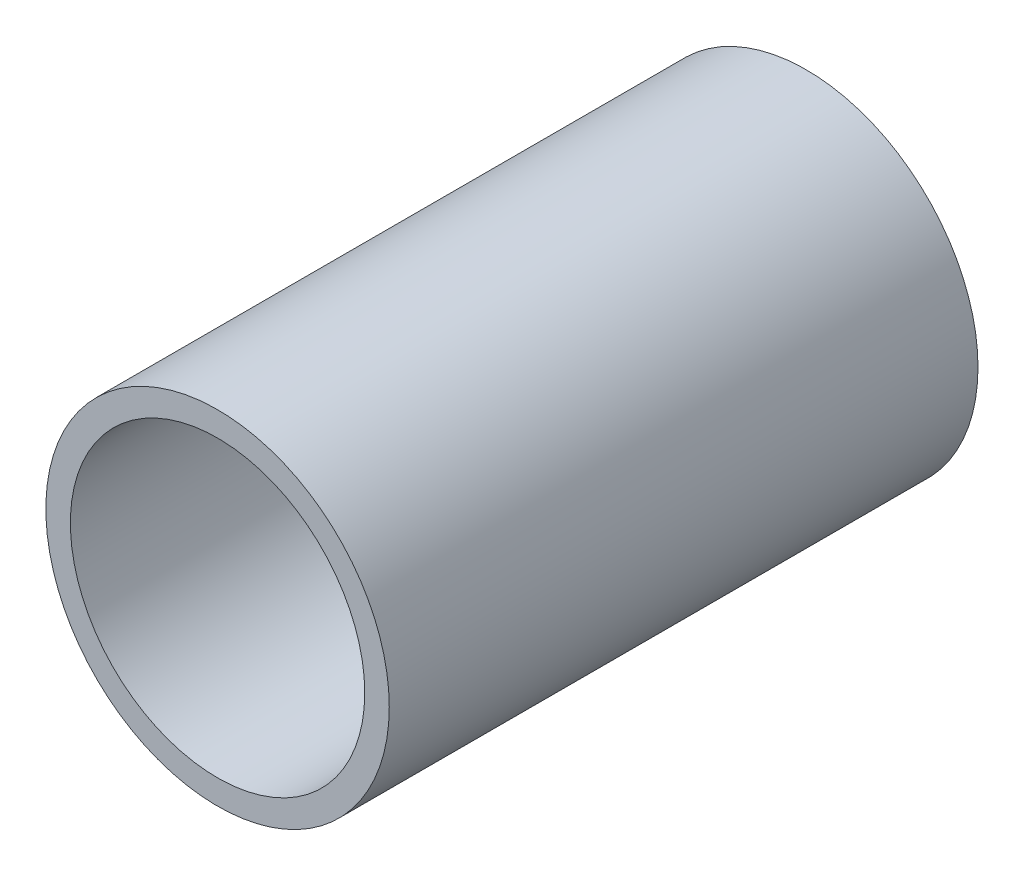
ISO-10303-21;
HEADER;
FILE_DESCRIPTION(('STEP AP214'),'2;1');
FILE_NAME('part.step','',(''),(''),'','','');
FILE_SCHEMA(('AUTOMOTIVE_DESIGN { 1 0 10303 214 1 1 1 1 }'));
ENDSEC;
DATA;
#1=APPLICATION_CONTEXT('core data for automotive mechanical design processes');
#2=APPLICATION_PROTOCOL_DEFINITION('international standard','automotive_design',2000,#1);
#3=PRODUCT_CONTEXT('',#1,'mechanical');
#4=PRODUCT('Part','Part','',(#3));
#5=PRODUCT_RELATED_PRODUCT_CATEGORY('part','',(#4));
#6=PRODUCT_DEFINITION_FORMATION('','',#4);
#7=PRODUCT_DEFINITION_CONTEXT('part definition',#1,'design');
#8=PRODUCT_DEFINITION('design','',#6,#7);
#9=PRODUCT_DEFINITION_SHAPE('','',#8);
#10=(LENGTH_UNIT() NAMED_UNIT(*) SI_UNIT(.MILLI.,.METRE.));
#11=(NAMED_UNIT(*) PLANE_ANGLE_UNIT() SI_UNIT($,.RADIAN.));
#12=(NAMED_UNIT(*) SI_UNIT($,.STERADIAN.) SOLID_ANGLE_UNIT());
#13=UNCERTAINTY_MEASURE_WITH_UNIT(LENGTH_MEASURE(1.E-05),#10,'distance_accuracy_value','');
#14=(GEOMETRIC_REPRESENTATION_CONTEXT(3) GLOBAL_UNCERTAINTY_ASSIGNED_CONTEXT((#13)) GLOBAL_UNIT_ASSIGNED_CONTEXT((#10,
#11,#12)) REPRESENTATION_CONTEXT('',''));
#15=CARTESIAN_POINT('',(0.,0.,0.));
#16=DIRECTION('',(0.,0.,1.));
#17=DIRECTION('',(1.,0.,0.));
#18=AXIS2_PLACEMENT_3D('',#15,#16,#17);
#19=CARTESIAN_POINT('',(0.,0.,120.));
#20=DIRECTION('',(0.,0.,1.));
#21=DIRECTION('',(1.,0.,0.));
#22=AXIS2_PLACEMENT_3D('',#19,#20,#21);
#23=PLANE('',#22);
#24=CARTESIAN_POINT('',(0.,0.,120.));
#25=DIRECTION('',(0.,0.,1.));
#26=DIRECTION('',(1.,0.,0.));
#27=AXIS2_PLACEMENT_3D('',#24,#25,#26);
#28=CIRCLE('',#27,35.);
#29=CARTESIAN_POINT('',(35.,0.,120.));
#30=VERTEX_POINT('',#29);
#31=EDGE_CURVE('E10',#30,#30,#28,.T.);
#32=ORIENTED_EDGE('',*,*,#31,.T.);
#33=EDGE_LOOP('',(#32));
#34=FACE_BOUND('',#33,.T.);
#35=CARTESIAN_POINT('',(0.,0.,120.));
#36=DIRECTION('',(0.,0.,1.));
#37=DIRECTION('',(1.,0.,0.));
#38=AXIS2_PLACEMENT_3D('',#35,#36,#37);
#39=CIRCLE('',#38,30.);
#40=CARTESIAN_POINT('',(30.,0.,120.));
#41=VERTEX_POINT('',#40);
#42=EDGE_CURVE('E42',#41,#41,#39,.T.);
#43=ORIENTED_EDGE('',*,*,#42,.F.);
#44=EDGE_LOOP('',(#43));
#45=FACE_BOUND('',#44,.T.);
#46=ADVANCED_FACE('F31',(#34,#45),#23,.T.);
#47=CARTESIAN_POINT('',(0.,0.,0.));
#48=DIRECTION('',(0.,0.,1.));
#49=DIRECTION('',(1.,0.,0.));
#50=AXIS2_PLACEMENT_3D('',#47,#48,#49);
#51=PLANE('',#50);
#52=CARTESIAN_POINT('',(0.,0.,0.));
#53=DIRECTION('',(0.,0.,1.));
#54=DIRECTION('',(1.,0.,0.));
#55=AXIS2_PLACEMENT_3D('',#52,#53,#54);
#56=CIRCLE('',#55,35.);
#57=CARTESIAN_POINT('',(35.,0.,0.));
#58=VERTEX_POINT('',#57);
#59=EDGE_CURVE('E35',#58,#58,#56,.T.);
#60=ORIENTED_EDGE('',*,*,#59,.F.);
#61=EDGE_LOOP('',(#60));
#62=FACE_BOUND('',#61,.T.);
#63=CARTESIAN_POINT('',(0.,0.,0.));
#64=DIRECTION('',(0.,0.,1.));
#65=DIRECTION('',(1.,0.,0.));
#66=AXIS2_PLACEMENT_3D('',#63,#64,#65);
#67=CIRCLE('',#66,30.);
#68=CARTESIAN_POINT('',(30.,0.,0.));
#69=VERTEX_POINT('',#68);
#70=EDGE_CURVE('E44',#69,#69,#67,.T.);
#71=ORIENTED_EDGE('',*,*,#70,.T.);
#72=EDGE_LOOP('',(#71));
#73=FACE_BOUND('',#72,.T.);
#74=ADVANCED_FACE('F54',(#62,#73),#51,.F.);
#75=CARTESIAN_POINT('',(0.,0.,120.));
#76=DIRECTION('',(0.,0.,-1.));
#77=DIRECTION('',(-1.,0.,0.));
#78=AXIS2_PLACEMENT_3D('',#75,#76,#77);
#79=CYLINDRICAL_SURFACE('',#78,35.);
#80=ORIENTED_EDGE('',*,*,#31,.F.);
#81=EDGE_LOOP('',(#80));
#82=FACE_BOUND('',#81,.T.);
#83=ORIENTED_EDGE('',*,*,#59,.T.);
#84=EDGE_LOOP('',(#83));
#85=FACE_BOUND('',#84,.T.);
#86=ADVANCED_FACE('F33',(#82,#85),#79,.T.);
#87=CARTESIAN_POINT('',(0.,0.,120.));
#88=DIRECTION('',(0.,0.,-1.));
#89=DIRECTION('',(-1.,0.,0.));
#90=AXIS2_PLACEMENT_3D('',#87,#88,#89);
#91=CYLINDRICAL_SURFACE('',#90,30.);
#92=ORIENTED_EDGE('',*,*,#42,.T.);
#93=EDGE_LOOP('',(#92));
#94=FACE_BOUND('',#93,.T.);
#95=ORIENTED_EDGE('',*,*,#70,.F.);
#96=EDGE_LOOP('',(#95));
#97=FACE_BOUND('',#96,.T.);
#98=ADVANCED_FACE('F50',(#94,#97),#91,.F.);
#99=CLOSED_SHELL('',(#46,#74,#86,#98));
#100=MANIFOLD_SOLID_BREP('B2',#99);
#101=ADVANCED_BREP_SHAPE_REPRESENTATION('',(#18,#100),#14);
#102=SHAPE_DEFINITION_REPRESENTATION(#9,#101);
ENDSEC;
END-ISO-10303-21;
